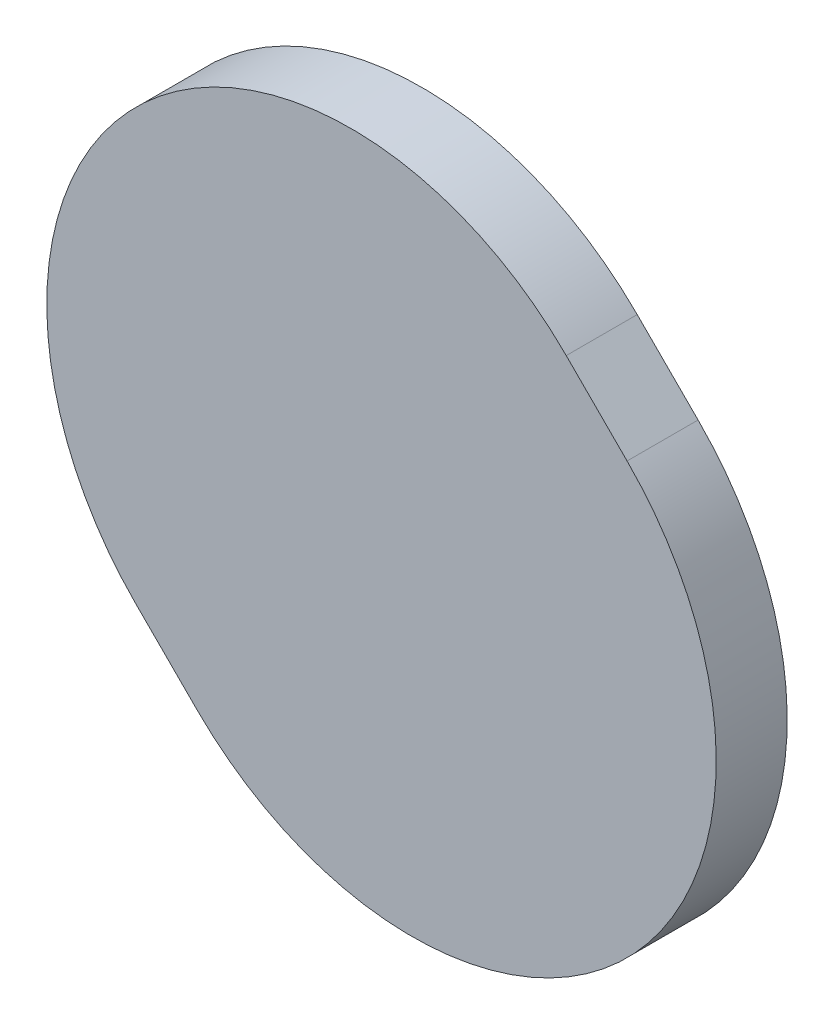
ISO-10303-21;
HEADER;
FILE_DESCRIPTION(('STEP AP214'),'2;1');
FILE_NAME('part.step','',(''),(''),'','','');
FILE_SCHEMA(('AUTOMOTIVE_DESIGN { 1 0 10303 214 1 1 1 1 }'));
ENDSEC;
DATA;
#1=APPLICATION_CONTEXT('core data for automotive mechanical design processes');
#2=APPLICATION_PROTOCOL_DEFINITION('international standard','automotive_design',2000,#1);
#3=PRODUCT_CONTEXT('',#1,'mechanical');
#4=PRODUCT('Part','Part','',(#3));
#5=PRODUCT_RELATED_PRODUCT_CATEGORY('part','',(#4));
#6=PRODUCT_DEFINITION_FORMATION('','',#4);
#7=PRODUCT_DEFINITION_CONTEXT('part definition',#1,'design');
#8=PRODUCT_DEFINITION('design','',#6,#7);
#9=PRODUCT_DEFINITION_SHAPE('','',#8);
#10=(LENGTH_UNIT() NAMED_UNIT(*) SI_UNIT(.MILLI.,.METRE.));
#11=(NAMED_UNIT(*) PLANE_ANGLE_UNIT() SI_UNIT($,.RADIAN.));
#12=(NAMED_UNIT(*) SI_UNIT($,.STERADIAN.) SOLID_ANGLE_UNIT());
#13=UNCERTAINTY_MEASURE_WITH_UNIT(LENGTH_MEASURE(1.E-05),#10,'distance_accuracy_value','');
#14=(GEOMETRIC_REPRESENTATION_CONTEXT(3) GLOBAL_UNCERTAINTY_ASSIGNED_CONTEXT((#13)) GLOBAL_UNIT_ASSIGNED_CONTEXT((#10,
#11,#12)) REPRESENTATION_CONTEXT('',''));
#15=CARTESIAN_POINT('',(0.,0.,0.));
#16=DIRECTION('',(0.,0.,1.));
#17=DIRECTION('',(1.,0.,0.));
#18=AXIS2_PLACEMENT_3D('',#15,#16,#17);
#19=CARTESIAN_POINT('',(107.663933,-127.026066,1.635));
#20=DIRECTION('',(0.,0.,1.));
#21=DIRECTION('',(1.,0.,0.));
#22=AXIS2_PLACEMENT_3D('',#19,#20,#21);
#23=PLANE('',#22);
#24=DIRECTION('',(0.707106781186548,-0.707106781186548,0.));
#25=VECTOR('',#24,1.);
#26=CARTESIAN_POINT('',(107.663933,-127.026066,1.635));
#27=LINE('',#26,#25);
#28=CARTESIAN_POINT('',(107.663933,-127.026066,1.635));
#29=VERTEX_POINT('',#28);
#30=CARTESIAN_POINT('',(107.693933,-127.056066,1.635));
#31=VERTEX_POINT('',#30);
#32=EDGE_CURVE('E98',#29,#31,#27,.T.);
#33=ORIENTED_EDGE('',*,*,#32,.T.);
#34=CARTESIAN_POINT('',(107.7999995,-126.9499995,1.635));
#35=DIRECTION('',(0.,0.,1.));
#36=DIRECTION('',(-0.707106781186548,-0.707106781186548,0.));
#37=AXIS2_PLACEMENT_3D('',#34,#35,#36);
#38=CIRCLE('',#37,0.150000682813);
#39=CARTESIAN_POINT('',(107.906066,-126.843933,1.635));
#40=VERTEX_POINT('',#39);
#41=EDGE_CURVE('E79',#31,#40,#38,.T.);
#42=ORIENTED_EDGE('',*,*,#41,.T.);
#43=DIRECTION('',(-0.707106781186548,0.707106781186548,0.));
#44=VECTOR('',#43,1.);
#45=CARTESIAN_POINT('',(107.906066,-126.843933,1.635));
#46=LINE('',#45,#44);
#47=CARTESIAN_POINT('',(107.876066,-126.813933,1.635));
#48=VERTEX_POINT('',#47);
#49=EDGE_CURVE('E64',#40,#48,#46,.T.);
#50=ORIENTED_EDGE('',*,*,#49,.T.);
#51=CARTESIAN_POINT('',(107.7699995,-126.9199995,1.635));
#52=DIRECTION('',(0.,0.,1.));
#53=DIRECTION('',(0.707106781186548,0.707106781186548,0.));
#54=AXIS2_PLACEMENT_3D('',#51,#52,#53);
#55=CIRCLE('',#54,0.150000682813);
#56=EDGE_CURVE('E11',#48,#29,#55,.T.);
#57=ORIENTED_EDGE('',*,*,#56,.T.);
#58=EDGE_LOOP('',(#33,#42,#50,#57));
#59=FACE_BOUND('',#58,.T.);
#60=ADVANCED_FACE('F17',(#59),#23,.T.);
#61=CARTESIAN_POINT('',(107.663933,-127.026066,1.6));
#62=DIRECTION('',(0.,0.,1.));
#63=DIRECTION('',(1.,0.,0.));
#64=AXIS2_PLACEMENT_3D('',#61,#62,#63);
#65=PLANE('',#64);
#66=CARTESIAN_POINT('',(107.7699995,-126.9199995,1.6));
#67=DIRECTION('',(0.,0.,1.));
#68=DIRECTION('',(0.707106781186548,0.707106781186548,0.));
#69=AXIS2_PLACEMENT_3D('',#66,#67,#68);
#70=CIRCLE('',#69,0.150000682813);
#71=CARTESIAN_POINT('',(107.876066,-126.813933,1.6));
#72=VERTEX_POINT('',#71);
#73=CARTESIAN_POINT('',(107.663933,-127.026066,1.6));
#74=VERTEX_POINT('',#73);
#75=EDGE_CURVE('E20',#72,#74,#70,.T.);
#76=ORIENTED_EDGE('',*,*,#75,.F.);
#77=DIRECTION('',(-0.707106781186548,0.707106781186548,0.));
#78=VECTOR('',#77,1.);
#79=CARTESIAN_POINT('',(107.906066,-126.843933,1.6));
#80=LINE('',#79,#78);
#81=CARTESIAN_POINT('',(107.906066,-126.843933,1.6));
#82=VERTEX_POINT('',#81);
#83=EDGE_CURVE('E71',#82,#72,#80,.T.);
#84=ORIENTED_EDGE('',*,*,#83,.F.);
#85=CARTESIAN_POINT('',(107.7999995,-126.9499995,1.6));
#86=DIRECTION('',(0.,0.,1.));
#87=DIRECTION('',(-0.707106781186548,-0.707106781186548,0.));
#88=AXIS2_PLACEMENT_3D('',#85,#86,#87);
#89=CIRCLE('',#88,0.150000682813);
#90=CARTESIAN_POINT('',(107.693933,-127.056066,1.6));
#91=VERTEX_POINT('',#90);
#92=EDGE_CURVE('E75',#91,#82,#89,.T.);
#93=ORIENTED_EDGE('',*,*,#92,.F.);
#94=DIRECTION('',(0.707106781186548,-0.707106781186548,0.));
#95=VECTOR('',#94,1.);
#96=CARTESIAN_POINT('',(107.663933,-127.026066,1.6));
#97=LINE('',#96,#95);
#98=EDGE_CURVE('E116',#74,#91,#97,.T.);
#99=ORIENTED_EDGE('',*,*,#98,.F.);
#100=EDGE_LOOP('',(#76,#84,#93,#99));
#101=FACE_BOUND('',#100,.T.);
#102=ADVANCED_FACE('F72',(#101),#65,.F.);
#103=CARTESIAN_POINT('',(107.7699995,-126.9199995,1.6));
#104=DIRECTION('',(0.,0.,-1.));
#105=DIRECTION('',(0.707106781186548,0.707106781186548,0.));
#106=AXIS2_PLACEMENT_3D('',#103,#104,#105);
#107=CYLINDRICAL_SURFACE('',#106,0.150000682813);
#108=ORIENTED_EDGE('',*,*,#75,.T.);
#109=DIRECTION('',(0.,0.,1.));
#110=VECTOR('',#109,1.);
#111=CARTESIAN_POINT('',(107.663933,-127.026066,1.6));
#112=LINE('',#111,#110);
#113=EDGE_CURVE('E92',#74,#29,#112,.T.);
#114=ORIENTED_EDGE('',*,*,#113,.T.);
#115=ORIENTED_EDGE('',*,*,#56,.F.);
#116=DIRECTION('',(0.,0.,1.));
#117=VECTOR('',#116,1.);
#118=CARTESIAN_POINT('',(107.876066,-126.813933,1.6));
#119=LINE('',#118,#117);
#120=EDGE_CURVE('E78',#72,#48,#119,.T.);
#121=ORIENTED_EDGE('',*,*,#120,.F.);
#122=EDGE_LOOP('',(#108,#114,#115,#121));
#123=FACE_BOUND('',#122,.T.);
#124=ADVANCED_FACE('F112',(#123),#107,.T.);
#125=CARTESIAN_POINT('',(107.906066,-126.843933,1.6));
#126=DIRECTION('',(-0.707106781186548,-0.707106781186548,0.));
#127=DIRECTION('',(-0.707106781186548,0.707106781186548,0.));
#128=AXIS2_PLACEMENT_3D('',#125,#126,#127);
#129=PLANE('',#128);
#130=ORIENTED_EDGE('',*,*,#83,.T.);
#131=ORIENTED_EDGE('',*,*,#120,.T.);
#132=ORIENTED_EDGE('',*,*,#49,.F.);
#133=DIRECTION('',(0.,0.,1.));
#134=VECTOR('',#133,1.);
#135=CARTESIAN_POINT('',(107.906066,-126.843933,1.6));
#136=LINE('',#135,#134);
#137=EDGE_CURVE('E82',#82,#40,#136,.T.);
#138=ORIENTED_EDGE('',*,*,#137,.F.);
#139=EDGE_LOOP('',(#130,#131,#132,#138));
#140=FACE_BOUND('',#139,.T.);
#141=ADVANCED_FACE('F83',(#140),#129,.F.);
#142=CARTESIAN_POINT('',(107.7999995,-126.9499995,1.6));
#143=DIRECTION('',(0.,0.,-1.));
#144=DIRECTION('',(-0.707106781186548,-0.707106781186548,0.));
#145=AXIS2_PLACEMENT_3D('',#142,#143,#144);
#146=CYLINDRICAL_SURFACE('',#145,0.150000682813);
#147=ORIENTED_EDGE('',*,*,#92,.T.);
#148=ORIENTED_EDGE('',*,*,#137,.T.);
#149=ORIENTED_EDGE('',*,*,#41,.F.);
#150=DIRECTION('',(0.,0.,1.));
#151=VECTOR('',#150,1.);
#152=CARTESIAN_POINT('',(107.693933,-127.056066,1.6));
#153=LINE('',#152,#151);
#154=EDGE_CURVE('E89',#91,#31,#153,.T.);
#155=ORIENTED_EDGE('',*,*,#154,.F.);
#156=EDGE_LOOP('',(#147,#148,#149,#155));
#157=FACE_BOUND('',#156,.T.);
#158=ADVANCED_FACE('F87',(#157),#146,.T.);
#159=CARTESIAN_POINT('',(107.663933,-127.026066,1.6));
#160=DIRECTION('',(0.707106781186548,0.707106781186548,0.));
#161=DIRECTION('',(0.,0.,-1.));
#162=AXIS2_PLACEMENT_3D('',#159,#160,#161);
#163=PLANE('',#162);
#164=ORIENTED_EDGE('',*,*,#98,.T.);
#165=ORIENTED_EDGE('',*,*,#154,.T.);
#166=ORIENTED_EDGE('',*,*,#32,.F.);
#167=ORIENTED_EDGE('',*,*,#113,.F.);
#168=EDGE_LOOP('',(#164,#165,#166,#167));
#169=FACE_BOUND('',#168,.T.);
#170=ADVANCED_FACE('F115',(#169),#163,.F.);
#171=CLOSED_SHELL('',(#60,#102,#124,#141,#158,#170));
#172=MANIFOLD_SOLID_BREP('B1',#171);
#173=ADVANCED_BREP_SHAPE_REPRESENTATION('',(#18,#172),#14);
#174=SHAPE_DEFINITION_REPRESENTATION(#9,#173);
ENDSEC;
END-ISO-10303-21;
